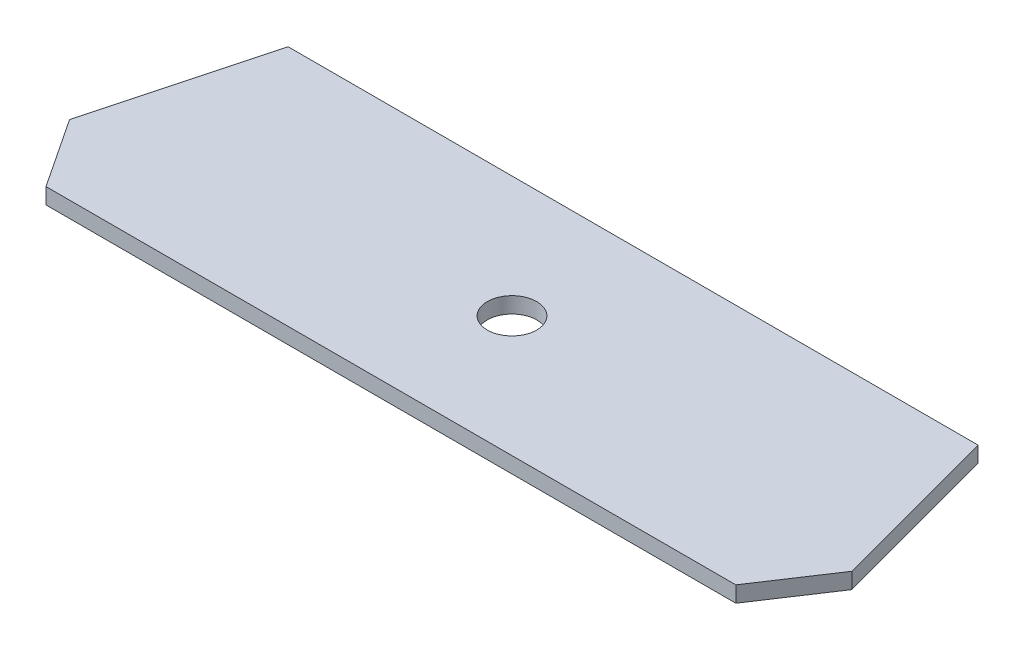
ISO-10303-21;
HEADER;
FILE_DESCRIPTION(('STEP AP214'),'2;1');
FILE_NAME('part.step','',(''),(''),'','','');
FILE_SCHEMA(('AUTOMOTIVE_DESIGN { 1 0 10303 214 1 1 1 1 }'));
ENDSEC;
DATA;
#1=APPLICATION_CONTEXT('core data for automotive mechanical design processes');
#2=APPLICATION_PROTOCOL_DEFINITION('international standard','automotive_design',2000,#1);
#3=PRODUCT_CONTEXT('',#1,'mechanical');
#4=PRODUCT('Part','Part','',(#3));
#5=PRODUCT_RELATED_PRODUCT_CATEGORY('part','',(#4));
#6=PRODUCT_DEFINITION_FORMATION('','',#4);
#7=PRODUCT_DEFINITION_CONTEXT('part definition',#1,'design');
#8=PRODUCT_DEFINITION('design','',#6,#7);
#9=PRODUCT_DEFINITION_SHAPE('','',#8);
#10=(LENGTH_UNIT() NAMED_UNIT(*) SI_UNIT(.MILLI.,.METRE.));
#11=(NAMED_UNIT(*) PLANE_ANGLE_UNIT() SI_UNIT($,.RADIAN.));
#12=(NAMED_UNIT(*) SI_UNIT($,.STERADIAN.) SOLID_ANGLE_UNIT());
#13=UNCERTAINTY_MEASURE_WITH_UNIT(LENGTH_MEASURE(1.E-05),#10,'distance_accuracy_value','');
#14=(GEOMETRIC_REPRESENTATION_CONTEXT(3) GLOBAL_UNCERTAINTY_ASSIGNED_CONTEXT((#13)) GLOBAL_UNIT_ASSIGNED_CONTEXT((#10,
#11,#12)) REPRESENTATION_CONTEXT('',''));
#15=CARTESIAN_POINT('',(0.,0.,0.));
#16=DIRECTION('',(0.,0.,1.));
#17=DIRECTION('',(1.,0.,0.));
#18=AXIS2_PLACEMENT_3D('',#15,#16,#17);
#19=CARTESIAN_POINT('',(62.3570000000001,2.54,8.18628624855271));
#20=DIRECTION('',(-0.965925826289068,0.,0.258819045102521));
#21=DIRECTION('',(0.258819045102521,0.,0.965925826289068));
#22=AXIS2_PLACEMENT_3D('',#19,#20,#21);
#23=PLANE('',#22);
#24=DIRECTION('',(-0.258819045102521,0.,-0.965925826289068));
#25=VECTOR('',#24,1.);
#26=CARTESIAN_POINT('',(62.3570000000001,0.,8.18628624855271));
#27=LINE('',#26,#25);
#28=CARTESIAN_POINT('',(62.3570000000001,0.,8.18628624855271));
#29=VERTEX_POINT('',#28);
#30=CARTESIAN_POINT('',(54.991,0.,-19.304));
#31=VERTEX_POINT('',#30);
#32=EDGE_CURVE('E117',#29,#31,#27,.T.);
#33=ORIENTED_EDGE('',*,*,#32,.T.);
#34=DIRECTION('',(0.,-1.,0.));
#35=VECTOR('',#34,1.);
#36=CARTESIAN_POINT('',(54.991,2.54,-19.304));
#37=LINE('',#36,#35);
#38=CARTESIAN_POINT('',(54.991,2.54,-19.304));
#39=VERTEX_POINT('',#38);
#40=EDGE_CURVE('E11',#39,#31,#37,.T.);
#41=ORIENTED_EDGE('',*,*,#40,.F.);
#42=DIRECTION('',(-0.258819045102521,0.,-0.965925826289068));
#43=VECTOR('',#42,1.);
#44=CARTESIAN_POINT('',(62.3570000000001,2.54,8.18628624855271));
#45=LINE('',#44,#43);
#46=CARTESIAN_POINT('',(62.3570000000001,2.54,8.18628624855271));
#47=VERTEX_POINT('',#46);
#48=EDGE_CURVE('E128',#47,#39,#45,.T.);
#49=ORIENTED_EDGE('',*,*,#48,.F.);
#50=DIRECTION('',(0.,-1.,0.));
#51=VECTOR('',#50,1.);
#52=CARTESIAN_POINT('',(62.3570000000001,2.54,8.18628624855271));
#53=LINE('',#52,#51);
#54=EDGE_CURVE('E113',#47,#29,#53,.T.);
#55=ORIENTED_EDGE('',*,*,#54,.T.);
#56=EDGE_LOOP('',(#33,#41,#49,#55));
#57=FACE_BOUND('',#56,.T.);
#58=ADVANCED_FACE('F33',(#57),#23,.F.);
#59=CARTESIAN_POINT('',(-54.991,2.54,-19.304));
#60=DIRECTION('',(0.,0.,1.));
#61=DIRECTION('',(1.,0.,0.));
#62=AXIS2_PLACEMENT_3D('',#59,#60,#61);
#63=PLANE('',#62);
#64=DIRECTION('',(-1.,0.,0.));
#65=VECTOR('',#64,1.);
#66=CARTESIAN_POINT('',(-54.991,0.,-19.304));
#67=LINE('',#66,#65);
#68=CARTESIAN_POINT('',(-54.991,0.,-19.304));
#69=VERTEX_POINT('',#68);
#70=EDGE_CURVE('E120',#31,#69,#67,.T.);
#71=ORIENTED_EDGE('',*,*,#70,.T.);
#72=DIRECTION('',(0.,-1.,0.));
#73=VECTOR('',#72,1.);
#74=CARTESIAN_POINT('',(-54.991,2.54,-19.304));
#75=LINE('',#74,#73);
#76=CARTESIAN_POINT('',(-54.991,2.54,-19.304));
#77=VERTEX_POINT('',#76);
#78=EDGE_CURVE('E41',#77,#69,#75,.T.);
#79=ORIENTED_EDGE('',*,*,#78,.F.);
#80=DIRECTION('',(-1.,0.,0.));
#81=VECTOR('',#80,1.);
#82=CARTESIAN_POINT('',(-54.991,2.54,-19.304));
#83=LINE('',#82,#81);
#84=EDGE_CURVE('E86',#39,#77,#83,.T.);
#85=ORIENTED_EDGE('',*,*,#84,.F.);
#86=ORIENTED_EDGE('',*,*,#40,.T.);
#87=EDGE_LOOP('',(#71,#79,#85,#86));
#88=FACE_BOUND('',#87,.T.);
#89=ADVANCED_FACE('F153',(#88),#63,.F.);
#90=CARTESIAN_POINT('',(-54.991,2.54,-19.304));
#91=DIRECTION('',(0.96592582628907,0.,0.258819045102514));
#92=DIRECTION('',(0.258819045102514,0.,-0.96592582628907));
#93=AXIS2_PLACEMENT_3D('',#90,#91,#92);
#94=PLANE('',#93);
#95=DIRECTION('',(-0.258819045102514,0.,0.96592582628907));
#96=VECTOR('',#95,1.);
#97=CARTESIAN_POINT('',(-54.991,0.,-19.304));
#98=LINE('',#97,#96);
#99=CARTESIAN_POINT('',(-62.3569999999999,0.,8.18628624855271));
#100=VERTEX_POINT('',#99);
#101=EDGE_CURVE('E123',#69,#100,#98,.T.);
#102=ORIENTED_EDGE('',*,*,#101,.T.);
#103=DIRECTION('',(0.,-1.,0.));
#104=VECTOR('',#103,1.);
#105=CARTESIAN_POINT('',(-62.3569999999999,2.54,8.18628624855271));
#106=LINE('',#105,#104);
#107=CARTESIAN_POINT('',(-62.3569999999999,2.54,8.18628624855271));
#108=VERTEX_POINT('',#107);
#109=EDGE_CURVE('E108',#108,#100,#106,.T.);
#110=ORIENTED_EDGE('',*,*,#109,.F.);
#111=DIRECTION('',(-0.258819045102514,0.,0.96592582628907));
#112=VECTOR('',#111,1.);
#113=CARTESIAN_POINT('',(-54.991,2.54,-19.304));
#114=LINE('',#113,#112);
#115=EDGE_CURVE('E99',#77,#108,#114,.T.);
#116=ORIENTED_EDGE('',*,*,#115,.F.);
#117=ORIENTED_EDGE('',*,*,#78,.T.);
#118=EDGE_LOOP('',(#102,#110,#116,#117));
#119=FACE_BOUND('',#118,.T.);
#120=ADVANCED_FACE('F134',(#119),#94,.F.);
#121=CARTESIAN_POINT('',(-62.3569999999999,2.54,8.18628624855271));
#122=DIRECTION('',(0.833632224826601,0.,-0.552319937835537));
#123=DIRECTION('',(-0.552319937835537,0.,-0.833632224826601));
#124=AXIS2_PLACEMENT_3D('',#121,#122,#123);
#125=PLANE('',#124);
#126=DIRECTION('',(0.552319937835537,0.,0.833632224826601));
#127=VECTOR('',#126,1.);
#128=CARTESIAN_POINT('',(-62.3569999999999,0.,8.18628624855271));
#129=LINE('',#128,#127);
#130=CARTESIAN_POINT('',(-54.991,0.,19.304));
#131=VERTEX_POINT('',#130);
#132=EDGE_CURVE('E107',#100,#131,#129,.T.);
#133=ORIENTED_EDGE('',*,*,#132,.T.);
#134=DIRECTION('',(0.,-1.,0.));
#135=VECTOR('',#134,1.);
#136=CARTESIAN_POINT('',(-54.991,2.54,19.304));
#137=LINE('',#136,#135);
#138=CARTESIAN_POINT('',(-54.991,2.54,19.304));
#139=VERTEX_POINT('',#138);
#140=EDGE_CURVE('E104',#139,#131,#137,.T.);
#141=ORIENTED_EDGE('',*,*,#140,.F.);
#142=DIRECTION('',(0.552319937835537,0.,0.833632224826601));
#143=VECTOR('',#142,1.);
#144=CARTESIAN_POINT('',(-62.3569999999999,2.54,8.18628624855271));
#145=LINE('',#144,#143);
#146=EDGE_CURVE('E93',#108,#139,#145,.T.);
#147=ORIENTED_EDGE('',*,*,#146,.F.);
#148=ORIENTED_EDGE('',*,*,#109,.T.);
#149=EDGE_LOOP('',(#133,#141,#147,#148));
#150=FACE_BOUND('',#149,.T.);
#151=ADVANCED_FACE('F105',(#150),#125,.F.);
#152=CARTESIAN_POINT('',(-54.991,2.54,19.304));
#153=DIRECTION('',(0.,0.,-1.));
#154=DIRECTION('',(-1.,0.,0.));
#155=AXIS2_PLACEMENT_3D('',#152,#153,#154);
#156=PLANE('',#155);
#157=DIRECTION('',(1.,0.,0.));
#158=VECTOR('',#157,1.);
#159=CARTESIAN_POINT('',(-54.991,0.,19.304));
#160=LINE('',#159,#158);
#161=CARTESIAN_POINT('',(54.991,0.,19.304));
#162=VERTEX_POINT('',#161);
#163=EDGE_CURVE('E72',#131,#162,#160,.T.);
#164=ORIENTED_EDGE('',*,*,#163,.T.);
#165=DIRECTION('',(0.,-1.,0.));
#166=VECTOR('',#165,1.);
#167=CARTESIAN_POINT('',(54.991,2.54,19.304));
#168=LINE('',#167,#166);
#169=CARTESIAN_POINT('',(54.991,2.54,19.304));
#170=VERTEX_POINT('',#169);
#171=EDGE_CURVE('E109',#170,#162,#168,.T.);
#172=ORIENTED_EDGE('',*,*,#171,.F.);
#173=DIRECTION('',(1.,0.,0.));
#174=VECTOR('',#173,1.);
#175=CARTESIAN_POINT('',(-54.991,2.54,19.304));
#176=LINE('',#175,#174);
#177=EDGE_CURVE('E97',#139,#170,#176,.T.);
#178=ORIENTED_EDGE('',*,*,#177,.F.);
#179=ORIENTED_EDGE('',*,*,#140,.T.);
#180=EDGE_LOOP('',(#164,#172,#178,#179));
#181=FACE_BOUND('',#180,.T.);
#182=ADVANCED_FACE('F111',(#181),#156,.F.);
#183=CARTESIAN_POINT('',(54.991,2.54,19.304));
#184=DIRECTION('',(-0.833632224826594,0.,-0.552319937835548));
#185=DIRECTION('',(-0.552319937835548,0.,0.833632224826594));
#186=AXIS2_PLACEMENT_3D('',#183,#184,#185);
#187=PLANE('',#186);
#188=DIRECTION('',(0.552319937835548,0.,-0.833632224826594));
#189=VECTOR('',#188,1.);
#190=CARTESIAN_POINT('',(54.991,0.,19.304));
#191=LINE('',#190,#189);
#192=EDGE_CURVE('E78',#162,#29,#191,.T.);
#193=ORIENTED_EDGE('',*,*,#192,.T.);
#194=ORIENTED_EDGE('',*,*,#54,.F.);
#195=DIRECTION('',(0.552319937835548,0.,-0.833632224826594));
#196=VECTOR('',#195,1.);
#197=CARTESIAN_POINT('',(54.991,2.54,19.304));
#198=LINE('',#197,#196);
#199=EDGE_CURVE('E49',#170,#47,#198,.T.);
#200=ORIENTED_EDGE('',*,*,#199,.F.);
#201=ORIENTED_EDGE('',*,*,#171,.T.);
#202=EDGE_LOOP('',(#193,#194,#200,#201));
#203=FACE_BOUND('',#202,.T.);
#204=ADVANCED_FACE('F141',(#203),#187,.F.);
#205=CARTESIAN_POINT('',(0.,2.54,0.));
#206=DIRECTION('',(0.,-1.,0.));
#207=DIRECTION('',(0.,0.,-1.));
#208=AXIS2_PLACEMENT_3D('',#205,#206,#207);
#209=PLANE('',#208);
#210=CARTESIAN_POINT('',(0.,2.54,0.));
#211=DIRECTION('',(0.,1.,0.));
#212=DIRECTION('',(0.,0.,1.));
#213=AXIS2_PLACEMENT_3D('',#210,#211,#212);
#214=CIRCLE('',#213,3.937);
#215=CARTESIAN_POINT('',(0.,2.54,3.937));
#216=VERTEX_POINT('',#215);
#217=EDGE_CURVE('E206',#216,#216,#214,.T.);
#218=ORIENTED_EDGE('',*,*,#217,.F.);
#219=EDGE_LOOP('',(#218));
#220=FACE_BOUND('',#219,.T.);
#221=ORIENTED_EDGE('',*,*,#48,.T.);
#222=ORIENTED_EDGE('',*,*,#84,.T.);
#223=ORIENTED_EDGE('',*,*,#115,.T.);
#224=ORIENTED_EDGE('',*,*,#146,.T.);
#225=ORIENTED_EDGE('',*,*,#177,.T.);
#226=ORIENTED_EDGE('',*,*,#199,.T.);
#227=EDGE_LOOP('',(#221,#222,#223,#224,#225,#226));
#228=FACE_BOUND('',#227,.T.);
#229=ADVANCED_FACE('F95',(#220,#228),#209,.F.);
#230=CARTESIAN_POINT('',(0.,0.,0.));
#231=DIRECTION('',(0.,-1.,0.));
#232=DIRECTION('',(0.,0.,-1.));
#233=AXIS2_PLACEMENT_3D('',#230,#231,#232);
#234=PLANE('',#233);
#235=CARTESIAN_POINT('',(0.,0.,0.));
#236=DIRECTION('',(0.,-1.,0.));
#237=DIRECTION('',(0.,0.,-1.));
#238=AXIS2_PLACEMENT_3D('',#235,#236,#237);
#239=CIRCLE('',#238,3.937);
#240=CARTESIAN_POINT('',(0.,0.,-3.937));
#241=VERTEX_POINT('',#240);
#242=EDGE_CURVE('E121',#241,#241,#239,.F.);
#243=ORIENTED_EDGE('',*,*,#242,.T.);
#244=EDGE_LOOP('',(#243));
#245=FACE_BOUND('',#244,.T.);
#246=ORIENTED_EDGE('',*,*,#32,.F.);
#247=ORIENTED_EDGE('',*,*,#192,.F.);
#248=ORIENTED_EDGE('',*,*,#163,.F.);
#249=ORIENTED_EDGE('',*,*,#132,.F.);
#250=ORIENTED_EDGE('',*,*,#101,.F.);
#251=ORIENTED_EDGE('',*,*,#70,.F.);
#252=EDGE_LOOP('',(#246,#247,#248,#249,#250,#251));
#253=FACE_BOUND('',#252,.T.);
#254=ADVANCED_FACE('F137',(#245,#253),#234,.T.);
#255=CARTESIAN_POINT('',(0.,-11.1355175901257,0.));
#256=DIRECTION('',(0.,1.,0.));
#257=DIRECTION('',(0.,0.,1.));
#258=AXIS2_PLACEMENT_3D('',#255,#256,#257);
#259=CYLINDRICAL_SURFACE('',#258,3.937);
#260=ORIENTED_EDGE('',*,*,#217,.T.);
#261=EDGE_LOOP('',(#260));
#262=FACE_BOUND('',#261,.T.);
#263=ORIENTED_EDGE('',*,*,#242,.F.);
#264=EDGE_LOOP('',(#263));
#265=FACE_BOUND('',#264,.T.);
#266=ADVANCED_FACE('F190',(#262,#265),#259,.F.);
#267=CLOSED_SHELL('',(#58,#89,#120,#151,#182,#204,#229,#254,#266));
#268=MANIFOLD_SOLID_BREP('B2',#267);
#269=ADVANCED_BREP_SHAPE_REPRESENTATION('',(#18,#268),#14);
#270=SHAPE_DEFINITION_REPRESENTATION(#9,#269);
ENDSEC;
END-ISO-10303-21;
